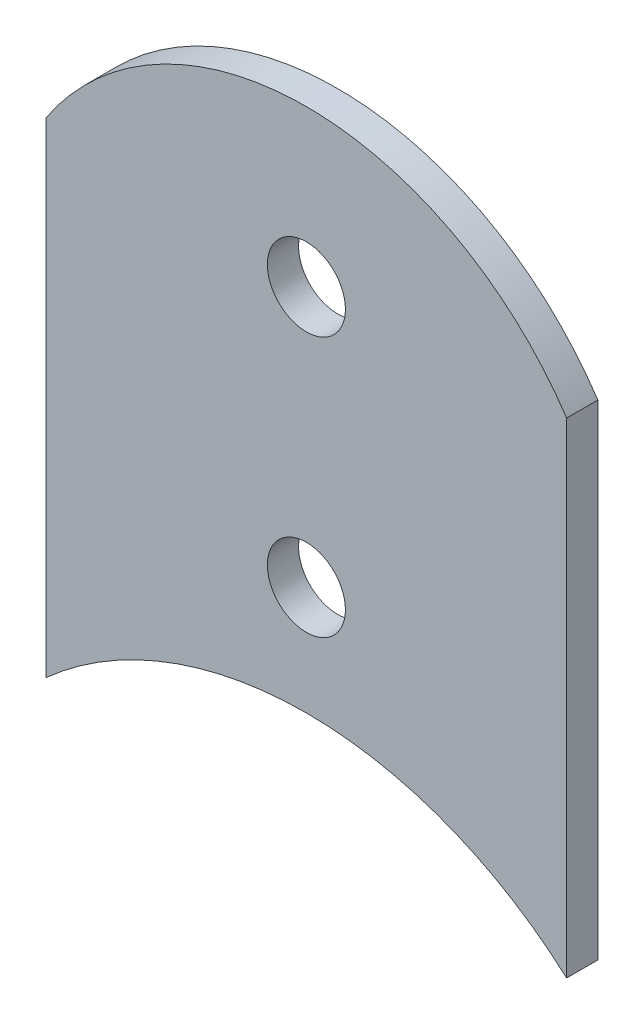
ISO-10303-21;
HEADER;
FILE_DESCRIPTION(('STEP AP214'),'2;1');
FILE_NAME('part.step','',(''),(''),'','','');
FILE_SCHEMA(('AUTOMOTIVE_DESIGN { 1 0 10303 214 1 1 1 1 }'));
ENDSEC;
DATA;
#1=APPLICATION_CONTEXT('core data for automotive mechanical design processes');
#2=APPLICATION_PROTOCOL_DEFINITION('international standard','automotive_design',2000,#1);
#3=PRODUCT_CONTEXT('',#1,'mechanical');
#4=PRODUCT('Part','Part','',(#3));
#5=PRODUCT_RELATED_PRODUCT_CATEGORY('part','',(#4));
#6=PRODUCT_DEFINITION_FORMATION('','',#4);
#7=PRODUCT_DEFINITION_CONTEXT('part definition',#1,'design');
#8=PRODUCT_DEFINITION('design','',#6,#7);
#9=PRODUCT_DEFINITION_SHAPE('','',#8);
#10=(LENGTH_UNIT() NAMED_UNIT(*) SI_UNIT(.MILLI.,.METRE.));
#11=(NAMED_UNIT(*) PLANE_ANGLE_UNIT() SI_UNIT($,.RADIAN.));
#12=(NAMED_UNIT(*) SI_UNIT($,.STERADIAN.) SOLID_ANGLE_UNIT());
#13=UNCERTAINTY_MEASURE_WITH_UNIT(LENGTH_MEASURE(1.E-05),#10,'distance_accuracy_value','');
#14=(GEOMETRIC_REPRESENTATION_CONTEXT(3) GLOBAL_UNCERTAINTY_ASSIGNED_CONTEXT((#13)) GLOBAL_UNIT_ASSIGNED_CONTEXT((#10,
#11,#12)) REPRESENTATION_CONTEXT('',''));
#15=CARTESIAN_POINT('',(0.,0.,0.));
#16=DIRECTION('',(0.,0.,1.));
#17=DIRECTION('',(1.,0.,0.));
#18=AXIS2_PLACEMENT_3D('',#15,#16,#17);
#19=CARTESIAN_POINT('',(0.,-179.386572288159,6.));
#20=DIRECTION('',(0.,0.,1.));
#21=DIRECTION('',(1.,0.,0.));
#22=AXIS2_PLACEMENT_3D('',#19,#20,#21);
#23=PLANE('',#22);
#24=CARTESIAN_POINT('',(0.,-83.4848728506647,6.));
#25=DIRECTION('',(0.,0.,1.));
#26=DIRECTION('',(1.,0.,0.));
#27=AXIS2_PLACEMENT_3D('',#24,#25,#26);
#28=CIRCLE('',#27,7.50000000000001);
#29=CARTESIAN_POINT('',(7.50000000000002,-83.4848728506647,6.));
#30=VERTEX_POINT('',#29);
#31=EDGE_CURVE('E112',#30,#30,#28,.T.);
#32=ORIENTED_EDGE('',*,*,#31,.F.);
#33=EDGE_LOOP('',(#32));
#34=FACE_BOUND('',#33,.T.);
#35=CARTESIAN_POINT('',(0.,-179.386572288159,6.));
#36=DIRECTION('',(0.,0.,-1.));
#37=DIRECTION('',(1.,0.,0.));
#38=AXIS2_PLACEMENT_3D('',#35,#36,#37);
#39=CIRCLE('',#38,75.);
#40=CARTESIAN_POINT('',(-50.,-123.484872850665,6.));
#41=VERTEX_POINT('',#40);
#42=CARTESIAN_POINT('',(50.,-123.484872850665,6.));
#43=VERTEX_POINT('',#42);
#44=EDGE_CURVE('E92',#41,#43,#39,.T.);
#45=ORIENTED_EDGE('',*,*,#44,.T.);
#46=DIRECTION('',(0.,1.,0.));
#47=VECTOR('',#46,1.);
#48=CARTESIAN_POINT('',(50.,-123.484872850665,6.));
#49=LINE('',#48,#47);
#50=CARTESIAN_POINT('',(50.,-30.3186249471107,6.));
#51=VERTEX_POINT('',#50);
#52=EDGE_CURVE('E87',#43,#51,#49,.T.);
#53=ORIENTED_EDGE('',*,*,#52,.T.);
#54=CARTESIAN_POINT('',(0.,-63.4848728506647,6.));
#55=DIRECTION('',(0.,0.,1.));
#56=DIRECTION('',(1.,0.,0.));
#57=AXIS2_PLACEMENT_3D('',#54,#55,#56);
#58=CIRCLE('',#57,60.);
#59=CARTESIAN_POINT('',(-50.,-30.3186249471108,6.));
#60=VERTEX_POINT('',#59);
#61=EDGE_CURVE('E90',#51,#60,#58,.T.);
#62=ORIENTED_EDGE('',*,*,#61,.T.);
#63=DIRECTION('',(0.,-1.,0.));
#64=VECTOR('',#63,1.);
#65=CARTESIAN_POINT('',(-50.,-123.484872850665,6.));
#66=LINE('',#65,#64);
#67=EDGE_CURVE('E57',#60,#41,#66,.T.);
#68=ORIENTED_EDGE('',*,*,#67,.T.);
#69=EDGE_LOOP('',(#45,#53,#62,#68));
#70=FACE_BOUND('',#69,.T.);
#71=CARTESIAN_POINT('',(0.,-33.4848728506647,6.));
#72=DIRECTION('',(0.,0.,1.));
#73=DIRECTION('',(1.,0.,0.));
#74=AXIS2_PLACEMENT_3D('',#71,#72,#73);
#75=CIRCLE('',#74,7.5);
#76=CARTESIAN_POINT('',(7.5,-33.4848728506647,6.));
#77=VERTEX_POINT('',#76);
#78=EDGE_CURVE('E134',#77,#77,#75,.T.);
#79=ORIENTED_EDGE('',*,*,#78,.F.);
#80=EDGE_LOOP('',(#79));
#81=FACE_BOUND('',#80,.T.);
#82=ADVANCED_FACE('F39',(#34,#70,#81),#23,.T.);
#83=CARTESIAN_POINT('',(0.,-179.386572288159,0.));
#84=DIRECTION('',(0.,0.,1.));
#85=DIRECTION('',(1.,0.,0.));
#86=AXIS2_PLACEMENT_3D('',#83,#84,#85);
#87=PLANE('',#86);
#88=CARTESIAN_POINT('',(0.,-179.386572288159,0.));
#89=DIRECTION('',(0.,0.,-1.));
#90=DIRECTION('',(1.,0.,0.));
#91=AXIS2_PLACEMENT_3D('',#88,#89,#90);
#92=CIRCLE('',#91,75.);
#93=CARTESIAN_POINT('',(-50.,-123.484872850665,0.));
#94=VERTEX_POINT('',#93);
#95=CARTESIAN_POINT('',(50.,-123.484872850665,0.));
#96=VERTEX_POINT('',#95);
#97=EDGE_CURVE('E108',#94,#96,#92,.T.);
#98=ORIENTED_EDGE('',*,*,#97,.F.);
#99=DIRECTION('',(0.,-1.,0.));
#100=VECTOR('',#99,1.);
#101=CARTESIAN_POINT('',(-50.,-123.484872850665,0.));
#102=LINE('',#101,#100);
#103=CARTESIAN_POINT('',(-50.,-30.3186249471108,0.));
#104=VERTEX_POINT('',#103);
#105=EDGE_CURVE('E80',#104,#94,#102,.T.);
#106=ORIENTED_EDGE('',*,*,#105,.F.);
#107=CARTESIAN_POINT('',(0.,-63.4848728506647,0.));
#108=DIRECTION('',(0.,0.,1.));
#109=DIRECTION('',(1.,0.,0.));
#110=AXIS2_PLACEMENT_3D('',#107,#108,#109);
#111=CIRCLE('',#110,60.);
#112=CARTESIAN_POINT('',(50.,-30.3186249471107,0.));
#113=VERTEX_POINT('',#112);
#114=EDGE_CURVE('E74',#113,#104,#111,.T.);
#115=ORIENTED_EDGE('',*,*,#114,.F.);
#116=DIRECTION('',(0.,1.,0.));
#117=VECTOR('',#116,1.);
#118=CARTESIAN_POINT('',(50.,-123.484872850665,0.));
#119=LINE('',#118,#117);
#120=EDGE_CURVE('E97',#96,#113,#119,.T.);
#121=ORIENTED_EDGE('',*,*,#120,.F.);
#122=EDGE_LOOP('',(#98,#106,#115,#121));
#123=FACE_BOUND('',#122,.T.);
#124=CARTESIAN_POINT('',(0.,-83.4848728506647,0.));
#125=DIRECTION('',(0.,0.,1.));
#126=DIRECTION('',(1.,0.,0.));
#127=AXIS2_PLACEMENT_3D('',#124,#125,#126);
#128=CIRCLE('',#127,7.50000000000001);
#129=CARTESIAN_POINT('',(7.50000000000002,-83.4848728506647,0.));
#130=VERTEX_POINT('',#129);
#131=EDGE_CURVE('E130',#130,#130,#128,.T.);
#132=ORIENTED_EDGE('',*,*,#131,.T.);
#133=EDGE_LOOP('',(#132));
#134=FACE_BOUND('',#133,.T.);
#135=CARTESIAN_POINT('',(0.,-33.4848728506647,0.));
#136=DIRECTION('',(0.,0.,1.));
#137=DIRECTION('',(1.,0.,0.));
#138=AXIS2_PLACEMENT_3D('',#135,#136,#137);
#139=CIRCLE('',#138,7.5);
#140=CARTESIAN_POINT('',(7.5,-33.4848728506647,0.));
#141=VERTEX_POINT('',#140);
#142=EDGE_CURVE('E138',#141,#141,#139,.T.);
#143=ORIENTED_EDGE('',*,*,#142,.T.);
#144=EDGE_LOOP('',(#143));
#145=FACE_BOUND('',#144,.T.);
#146=ADVANCED_FACE('F125',(#123,#134,#145),#87,.F.);
#147=CARTESIAN_POINT('',(0.,-179.386572288159,6.));
#148=DIRECTION('',(0.,0.,-1.));
#149=DIRECTION('',(-1.,0.,0.));
#150=AXIS2_PLACEMENT_3D('',#147,#148,#149);
#151=CYLINDRICAL_SURFACE('',#150,75.);
#152=ORIENTED_EDGE('',*,*,#97,.T.);
#153=DIRECTION('',(0.,0.,-1.));
#154=VECTOR('',#153,1.);
#155=CARTESIAN_POINT('',(50.,-123.484872850665,6.));
#156=LINE('',#155,#154);
#157=EDGE_CURVE('E11',#43,#96,#156,.T.);
#158=ORIENTED_EDGE('',*,*,#157,.F.);
#159=ORIENTED_EDGE('',*,*,#44,.F.);
#160=DIRECTION('',(0.,0.,-1.));
#161=VECTOR('',#160,1.);
#162=CARTESIAN_POINT('',(-50.,-123.484872850665,6.));
#163=LINE('',#162,#161);
#164=EDGE_CURVE('E104',#41,#94,#163,.T.);
#165=ORIENTED_EDGE('',*,*,#164,.T.);
#166=EDGE_LOOP('',(#152,#158,#159,#165));
#167=FACE_BOUND('',#166,.T.);
#168=ADVANCED_FACE('F41',(#167),#151,.F.);
#169=CARTESIAN_POINT('',(50.,-123.484872850665,6.));
#170=DIRECTION('',(-1.,0.,0.));
#171=DIRECTION('',(0.,-1.,0.));
#172=AXIS2_PLACEMENT_3D('',#169,#170,#171);
#173=PLANE('',#172);
#174=ORIENTED_EDGE('',*,*,#120,.T.);
#175=DIRECTION('',(0.,0.,-1.));
#176=VECTOR('',#175,1.);
#177=CARTESIAN_POINT('',(50.,-30.3186249471107,6.));
#178=LINE('',#177,#176);
#179=EDGE_CURVE('E49',#51,#113,#178,.T.);
#180=ORIENTED_EDGE('',*,*,#179,.F.);
#181=ORIENTED_EDGE('',*,*,#52,.F.);
#182=ORIENTED_EDGE('',*,*,#157,.T.);
#183=EDGE_LOOP('',(#174,#180,#181,#182));
#184=FACE_BOUND('',#183,.T.);
#185=ADVANCED_FACE('F96',(#184),#173,.F.);
#186=CARTESIAN_POINT('',(0.,-63.4848728506647,6.));
#187=DIRECTION('',(0.,0.,-1.));
#188=DIRECTION('',(-1.,0.,0.));
#189=AXIS2_PLACEMENT_3D('',#186,#187,#188);
#190=CYLINDRICAL_SURFACE('',#189,60.);
#191=ORIENTED_EDGE('',*,*,#114,.T.);
#192=DIRECTION('',(0.,0.,-1.));
#193=VECTOR('',#192,1.);
#194=CARTESIAN_POINT('',(-50.,-30.3186249471108,6.));
#195=LINE('',#194,#193);
#196=EDGE_CURVE('E99',#60,#104,#195,.T.);
#197=ORIENTED_EDGE('',*,*,#196,.F.);
#198=ORIENTED_EDGE('',*,*,#61,.F.);
#199=ORIENTED_EDGE('',*,*,#179,.T.);
#200=EDGE_LOOP('',(#191,#197,#198,#199));
#201=FACE_BOUND('',#200,.T.);
#202=ADVANCED_FACE('F100',(#201),#190,.T.);
#203=CARTESIAN_POINT('',(-50.,-123.484872850665,6.));
#204=DIRECTION('',(1.,0.,0.));
#205=DIRECTION('',(0.,1.,0.));
#206=AXIS2_PLACEMENT_3D('',#203,#204,#205);
#207=PLANE('',#206);
#208=ORIENTED_EDGE('',*,*,#105,.T.);
#209=ORIENTED_EDGE('',*,*,#164,.F.);
#210=ORIENTED_EDGE('',*,*,#67,.F.);
#211=ORIENTED_EDGE('',*,*,#196,.T.);
#212=EDGE_LOOP('',(#208,#209,#210,#211));
#213=FACE_BOUND('',#212,.T.);
#214=ADVANCED_FACE('F122',(#213),#207,.F.);
#215=CARTESIAN_POINT('',(0.,-83.4848728506647,6.));
#216=DIRECTION('',(0.,0.,-1.));
#217=DIRECTION('',(-1.,0.,0.));
#218=AXIS2_PLACEMENT_3D('',#215,#216,#217);
#219=CYLINDRICAL_SURFACE('',#218,7.50000000000001);
#220=ORIENTED_EDGE('',*,*,#31,.T.);
#221=EDGE_LOOP('',(#220));
#222=FACE_BOUND('',#221,.T.);
#223=ORIENTED_EDGE('',*,*,#131,.F.);
#224=EDGE_LOOP('',(#223));
#225=FACE_BOUND('',#224,.T.);
#226=ADVANCED_FACE('F157',(#222,#225),#219,.F.);
#227=CARTESIAN_POINT('',(0.,-33.4848728506647,6.));
#228=DIRECTION('',(0.,0.,-1.));
#229=DIRECTION('',(-1.,0.,0.));
#230=AXIS2_PLACEMENT_3D('',#227,#228,#229);
#231=CYLINDRICAL_SURFACE('',#230,7.5);
#232=ORIENTED_EDGE('',*,*,#78,.T.);
#233=EDGE_LOOP('',(#232));
#234=FACE_BOUND('',#233,.T.);
#235=ORIENTED_EDGE('',*,*,#142,.F.);
#236=EDGE_LOOP('',(#235));
#237=FACE_BOUND('',#236,.T.);
#238=ADVANCED_FACE('F146',(#234,#237),#231,.F.);
#239=CLOSED_SHELL('',(#82,#146,#168,#185,#202,#214,#226,#238));
#240=MANIFOLD_SOLID_BREP('B2',#239);
#241=ADVANCED_BREP_SHAPE_REPRESENTATION('',(#18,#240),#14);
#242=SHAPE_DEFINITION_REPRESENTATION(#9,#241);
ENDSEC;
END-ISO-10303-21;
